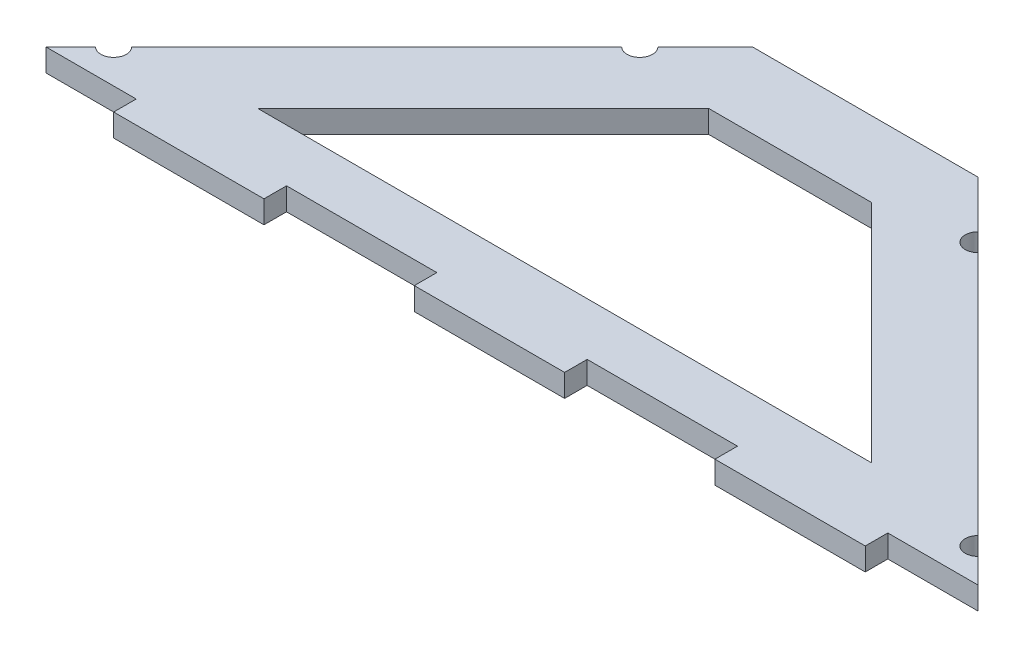
ISO-10303-21;
HEADER;
FILE_DESCRIPTION(('STEP AP214'),'2;1');
FILE_NAME('part.step','',(''),(''),'','','');
FILE_SCHEMA(('AUTOMOTIVE_DESIGN { 1 0 10303 214 1 1 1 1 }'));
ENDSEC;
DATA;
#1=APPLICATION_CONTEXT('core data for automotive mechanical design processes');
#2=APPLICATION_PROTOCOL_DEFINITION('international standard','automotive_design',2000,#1);
#3=PRODUCT_CONTEXT('',#1,'mechanical');
#4=PRODUCT('Part','Part','',(#3));
#5=PRODUCT_RELATED_PRODUCT_CATEGORY('part','',(#4));
#6=PRODUCT_DEFINITION_FORMATION('','',#4);
#7=PRODUCT_DEFINITION_CONTEXT('part definition',#1,'design');
#8=PRODUCT_DEFINITION('design','',#6,#7);
#9=PRODUCT_DEFINITION_SHAPE('','',#8);
#10=(LENGTH_UNIT() NAMED_UNIT(*) SI_UNIT(.MILLI.,.METRE.));
#11=(NAMED_UNIT(*) PLANE_ANGLE_UNIT() SI_UNIT($,.RADIAN.));
#12=(NAMED_UNIT(*) SI_UNIT($,.STERADIAN.) SOLID_ANGLE_UNIT());
#13=UNCERTAINTY_MEASURE_WITH_UNIT(LENGTH_MEASURE(1.E-05),#10,'distance_accuracy_value','');
#14=(GEOMETRIC_REPRESENTATION_CONTEXT(3) GLOBAL_UNCERTAINTY_ASSIGNED_CONTEXT((#13)) GLOBAL_UNIT_ASSIGNED_CONTEXT((#10,
#11,#12)) REPRESENTATION_CONTEXT('',''));
#15=CARTESIAN_POINT('',(0.,0.,0.));
#16=DIRECTION('',(0.,0.,1.));
#17=DIRECTION('',(1.,0.,0.));
#18=AXIS2_PLACEMENT_3D('',#15,#16,#17);
#19=CARTESIAN_POINT('',(0.,3.,65.));
#20=DIRECTION('',(0.,0.,-1.));
#21=DIRECTION('',(-1.,0.,0.));
#22=AXIS2_PLACEMENT_3D('',#19,#20,#21);
#23=PLANE('',#22);
#24=DIRECTION('',(0.,1.,0.));
#25=VECTOR('',#24,1.);
#26=CARTESIAN_POINT('',(-50.,-7.,65.));
#27=LINE('',#26,#25);
#28=CARTESIAN_POINT('',(-50.,0.,65.));
#29=VERTEX_POINT('',#28);
#30=CARTESIAN_POINT('',(-50.,3.,65.));
#31=VERTEX_POINT('',#30);
#32=EDGE_CURVE('E315',#29,#31,#27,.T.);
#33=ORIENTED_EDGE('',*,*,#32,.F.);
#34=DIRECTION('',(1.,0.,0.));
#35=VECTOR('',#34,1.);
#36=CARTESIAN_POINT('',(0.,0.,65.));
#37=LINE('',#36,#35);
#38=CARTESIAN_POINT('',(-30.,0.,65.));
#39=VERTEX_POINT('',#38);
#40=EDGE_CURVE('E502',#29,#39,#37,.T.);
#41=ORIENTED_EDGE('',*,*,#40,.T.);
#42=DIRECTION('',(0.,1.,0.));
#43=VECTOR('',#42,1.);
#44=CARTESIAN_POINT('',(-30.,-7.,65.));
#45=LINE('',#44,#43);
#46=CARTESIAN_POINT('',(-30.,3.,65.));
#47=VERTEX_POINT('',#46);
#48=EDGE_CURVE('E349',#39,#47,#45,.T.);
#49=ORIENTED_EDGE('',*,*,#48,.T.);
#50=DIRECTION('',(1.,0.,0.));
#51=VECTOR('',#50,1.);
#52=CARTESIAN_POINT('',(0.,3.,65.));
#53=LINE('',#52,#51);
#54=EDGE_CURVE('E515',#31,#47,#53,.T.);
#55=ORIENTED_EDGE('',*,*,#54,.F.);
#56=EDGE_LOOP('',(#33,#41,#49,#55));
#57=FACE_BOUND('',#56,.T.);
#58=ADVANCED_FACE('F118',(#57),#23,.F.);
#59=DIRECTION('',(0.,1.,0.));
#60=VECTOR('',#59,1.);
#61=CARTESIAN_POINT('',(-9.99999999999999,-7.,65.));
#62=LINE('',#61,#60);
#63=CARTESIAN_POINT('',(-9.99999999999999,0.,65.));
#64=VERTEX_POINT('',#63);
#65=CARTESIAN_POINT('',(-9.99999999999999,3.,65.));
#66=VERTEX_POINT('',#65);
#67=EDGE_CURVE('E325',#64,#66,#62,.T.);
#68=ORIENTED_EDGE('',*,*,#67,.F.);
#69=CARTESIAN_POINT('',(10.,0.,65.));
#70=VERTEX_POINT('',#69);
#71=EDGE_CURVE('E533',#64,#70,#37,.T.);
#72=ORIENTED_EDGE('',*,*,#71,.T.);
#73=DIRECTION('',(0.,1.,0.));
#74=VECTOR('',#73,1.);
#75=CARTESIAN_POINT('',(10.,-7.,65.));
#76=LINE('',#75,#74);
#77=CARTESIAN_POINT('',(10.,3.,65.));
#78=VERTEX_POINT('',#77);
#79=EDGE_CURVE('E371',#70,#78,#76,.T.);
#80=ORIENTED_EDGE('',*,*,#79,.T.);
#81=EDGE_CURVE('E514',#66,#78,#53,.T.);
#82=ORIENTED_EDGE('',*,*,#81,.F.);
#83=EDGE_LOOP('',(#68,#72,#80,#82));
#84=FACE_BOUND('',#83,.T.);
#85=ADVANCED_FACE('F602',(#84),#23,.F.);
#86=DIRECTION('',(0.,1.,0.));
#87=VECTOR('',#86,1.);
#88=CARTESIAN_POINT('',(30.,-7.,65.));
#89=LINE('',#88,#87);
#90=CARTESIAN_POINT('',(30.,0.,65.));
#91=VERTEX_POINT('',#90);
#92=CARTESIAN_POINT('',(30.,3.,65.));
#93=VERTEX_POINT('',#92);
#94=EDGE_CURVE('E339',#91,#93,#89,.T.);
#95=ORIENTED_EDGE('',*,*,#94,.F.);
#96=CARTESIAN_POINT('',(50.,0.,65.));
#97=VERTEX_POINT('',#96);
#98=EDGE_CURVE('E529',#91,#97,#37,.T.);
#99=ORIENTED_EDGE('',*,*,#98,.T.);
#100=DIRECTION('',(0.,1.,0.));
#101=VECTOR('',#100,1.);
#102=CARTESIAN_POINT('',(50.,-7.,65.));
#103=LINE('',#102,#101);
#104=CARTESIAN_POINT('',(50.,3.,65.));
#105=VERTEX_POINT('',#104);
#106=EDGE_CURVE('E361',#97,#105,#103,.T.);
#107=ORIENTED_EDGE('',*,*,#106,.T.);
#108=EDGE_CURVE('E510',#93,#105,#53,.T.);
#109=ORIENTED_EDGE('',*,*,#108,.F.);
#110=EDGE_LOOP('',(#95,#99,#107,#109));
#111=FACE_BOUND('',#110,.T.);
#112=ADVANCED_FACE('F617',(#111),#23,.F.);
#113=CARTESIAN_POINT('',(0.,0.,0.));
#114=DIRECTION('',(0.,1.,0.));
#115=DIRECTION('',(0.,0.,1.));
#116=AXIS2_PLACEMENT_3D('',#113,#114,#115);
#117=PLANE('',#116);
#118=DIRECTION('',(1.,0.,0.));
#119=VECTOR('',#118,1.);
#120=CARTESIAN_POINT('',(-25.,0.,25.));
#121=LINE('',#120,#119);
#122=CARTESIAN_POINT('',(-10.8578643762691,0.,25.));
#123=VERTEX_POINT('',#122);
#124=CARTESIAN_POINT('',(10.8578643762768,0.,25.));
#125=VERTEX_POINT('',#124);
#126=EDGE_CURVE('E558',#123,#125,#121,.T.);
#127=ORIENTED_EDGE('',*,*,#126,.F.);
#128=DIRECTION('',(0.707106781186547,0.,-0.707106781186548));
#129=VECTOR('',#128,1.);
#130=CARTESIAN_POINT('',(7.07106781186548,0.,7.07106781186548));
#131=LINE('',#130,#129);
#132=CARTESIAN_POINT('',(-40.857864376269,0.,55.));
#133=VERTEX_POINT('',#132);
#134=EDGE_CURVE('E525',#133,#123,#131,.T.);
#135=ORIENTED_EDGE('',*,*,#134,.F.);
#136=DIRECTION('',(1.,0.,0.));
#137=VECTOR('',#136,1.);
#138=CARTESIAN_POINT('',(0.,0.,55.));
#139=LINE('',#138,#137);
#140=CARTESIAN_POINT('',(40.8578643762768,0.,55.));
#141=VERTEX_POINT('',#140);
#142=EDGE_CURVE('E520',#133,#141,#139,.T.);
#143=ORIENTED_EDGE('',*,*,#142,.T.);
#144=DIRECTION('',(-0.707106781186548,0.,-0.707106781186547));
#145=VECTOR('',#144,1.);
#146=CARTESIAN_POINT('',(-7.0710678118616,0.,7.07106781186161));
#147=LINE('',#146,#145);
#148=EDGE_CURVE('E516',#141,#125,#147,.T.);
#149=ORIENTED_EDGE('',*,*,#148,.T.);
#150=EDGE_LOOP('',(#127,#135,#143,#149));
#151=FACE_BOUND('',#150,.T.);
#152=DIRECTION('',(0.,0.,1.));
#153=VECTOR('',#152,1.);
#154=CARTESIAN_POINT('',(-50.,0.,0.));
#155=LINE('',#154,#153);
#156=CARTESIAN_POINT('',(-50.,0.,62.));
#157=VERTEX_POINT('',#156);
#158=EDGE_CURVE('E424',#157,#29,#155,.T.);
#159=ORIENTED_EDGE('',*,*,#158,.F.);
#160=DIRECTION('',(-1.,0.,0.));
#161=VECTOR('',#160,1.);
#162=CARTESIAN_POINT('',(0.,0.,62.));
#163=LINE('',#162,#161);
#164=CARTESIAN_POINT('',(-62.,0.,62.));
#165=VERTEX_POINT('',#164);
#166=EDGE_CURVE('E311',#157,#165,#163,.T.);
#167=ORIENTED_EDGE('',*,*,#166,.T.);
#168=DIRECTION('',(0.707106781186548,0.,-0.707106781186548));
#169=VECTOR('',#168,1.);
#170=CARTESIAN_POINT('',(0.,0.,0.));
#171=LINE('',#170,#169);
#172=CARTESIAN_POINT('',(-58.7020815280171,0.,58.7020815280171));
#173=VERTEX_POINT('',#172);
#174=EDGE_CURVE('E455',#165,#173,#171,.T.);
#175=ORIENTED_EDGE('',*,*,#174,.T.);
#176=CARTESIAN_POINT('',(-57.5,0.,57.5));
#177=DIRECTION('',(0.,1.,0.));
#178=DIRECTION('',(0.,0.,1.));
#179=AXIS2_PLACEMENT_3D('',#176,#177,#178);
#180=CIRCLE('',#179,1.7);
#181=CARTESIAN_POINT('',(-56.2979184719829,0.,56.2979184719829));
#182=VERTEX_POINT('',#181);
#183=EDGE_CURVE('E481',#173,#182,#180,.T.);
#184=ORIENTED_EDGE('',*,*,#183,.T.);
#185=CARTESIAN_POINT('',(-23.7020815280171,0.,23.7020815280171));
#186=VERTEX_POINT('',#185);
#187=EDGE_CURVE('E450',#182,#186,#171,.T.);
#188=ORIENTED_EDGE('',*,*,#187,.T.);
#189=CARTESIAN_POINT('',(-22.5,0.,22.5));
#190=DIRECTION('',(0.,1.,0.));
#191=DIRECTION('',(0.,0.,1.));
#192=AXIS2_PLACEMENT_3D('',#189,#190,#191);
#193=CIRCLE('',#192,1.7);
#194=CARTESIAN_POINT('',(-21.2979184719829,0.,21.2979184719829));
#195=VERTEX_POINT('',#194);
#196=EDGE_CURVE('E473',#186,#195,#193,.T.);
#197=ORIENTED_EDGE('',*,*,#196,.T.);
#198=CARTESIAN_POINT('',(-15.,0.,15.));
#199=VERTEX_POINT('',#198);
#200=EDGE_CURVE('E456',#195,#199,#171,.T.);
#201=ORIENTED_EDGE('',*,*,#200,.T.);
#202=DIRECTION('',(1.,0.,0.));
#203=VECTOR('',#202,1.);
#204=CARTESIAN_POINT('',(-15.,0.,15.));
#205=LINE('',#204,#203);
#206=CARTESIAN_POINT('',(15.,0.,15.));
#207=VERTEX_POINT('',#206);
#208=EDGE_CURVE('E485',#199,#207,#205,.T.);
#209=ORIENTED_EDGE('',*,*,#208,.T.);
#210=DIRECTION('',(0.707106781186548,0.,0.707106781186547));
#211=VECTOR('',#210,1.);
#212=CARTESIAN_POINT('',(0.,0.,0.));
#213=LINE('',#212,#211);
#214=CARTESIAN_POINT('',(21.2979184719829,0.,21.2979184719829));
#215=VERTEX_POINT('',#214);
#216=EDGE_CURVE('E435',#207,#215,#213,.T.);
#217=ORIENTED_EDGE('',*,*,#216,.T.);
#218=CARTESIAN_POINT('',(22.5,0.,22.5));
#219=DIRECTION('',(0.,1.,0.));
#220=DIRECTION('',(0.,0.,1.));
#221=AXIS2_PLACEMENT_3D('',#218,#219,#220);
#222=CIRCLE('',#221,1.7);
#223=CARTESIAN_POINT('',(23.7020815280171,0.,23.7020815280171));
#224=VERTEX_POINT('',#223);
#225=EDGE_CURVE('E464',#215,#224,#222,.T.);
#226=ORIENTED_EDGE('',*,*,#225,.T.);
#227=CARTESIAN_POINT('',(56.2979184719829,0.,56.2979184719829));
#228=VERTEX_POINT('',#227);
#229=EDGE_CURVE('E440',#224,#228,#213,.T.);
#230=ORIENTED_EDGE('',*,*,#229,.T.);
#231=CARTESIAN_POINT('',(57.5,0.,57.5));
#232=DIRECTION('',(0.,1.,0.));
#233=DIRECTION('',(0.,0.,1.));
#234=AXIS2_PLACEMENT_3D('',#231,#232,#233);
#235=CIRCLE('',#234,1.7);
#236=CARTESIAN_POINT('',(58.7020815280172,0.,58.7020815280171));
#237=VERTEX_POINT('',#236);
#238=EDGE_CURVE('E490',#228,#237,#235,.T.);
#239=ORIENTED_EDGE('',*,*,#238,.T.);
#240=CARTESIAN_POINT('',(62.,0.,62.));
#241=VERTEX_POINT('',#240);
#242=EDGE_CURVE('E441',#237,#241,#213,.T.);
#243=ORIENTED_EDGE('',*,*,#242,.T.);
#244=DIRECTION('',(1.,0.,0.));
#245=VECTOR('',#244,1.);
#246=CARTESIAN_POINT('',(0.,0.,62.));
#247=LINE('',#246,#245);
#248=CARTESIAN_POINT('',(50.,0.,62.));
#249=VERTEX_POINT('',#248);
#250=EDGE_CURVE('E395',#249,#241,#247,.T.);
#251=ORIENTED_EDGE('',*,*,#250,.F.);
#252=DIRECTION('',(0.,0.,1.));
#253=VECTOR('',#252,1.);
#254=CARTESIAN_POINT('',(50.,0.,0.));
#255=LINE('',#254,#253);
#256=EDGE_CURVE('E398',#249,#97,#255,.T.);
#257=ORIENTED_EDGE('',*,*,#256,.T.);
#258=ORIENTED_EDGE('',*,*,#98,.F.);
#259=DIRECTION('',(0.,0.,1.));
#260=VECTOR('',#259,1.);
#261=CARTESIAN_POINT('',(30.,0.,0.));
#262=LINE('',#261,#260);
#263=CARTESIAN_POINT('',(30.,0.,62.));
#264=VERTEX_POINT('',#263);
#265=EDGE_CURVE('E410',#264,#91,#262,.T.);
#266=ORIENTED_EDGE('',*,*,#265,.F.);
#267=DIRECTION('',(-1.,0.,0.));
#268=VECTOR('',#267,1.);
#269=CARTESIAN_POINT('',(0.,0.,62.));
#270=LINE('',#269,#268);
#271=CARTESIAN_POINT('',(10.,0.,62.));
#272=VERTEX_POINT('',#271);
#273=EDGE_CURVE('E402',#264,#272,#270,.T.);
#274=ORIENTED_EDGE('',*,*,#273,.T.);
#275=DIRECTION('',(0.,0.,1.));
#276=VECTOR('',#275,1.);
#277=CARTESIAN_POINT('',(10.,0.,0.));
#278=LINE('',#277,#276);
#279=EDGE_CURVE('E406',#272,#70,#278,.T.);
#280=ORIENTED_EDGE('',*,*,#279,.T.);
#281=ORIENTED_EDGE('',*,*,#71,.F.);
#282=DIRECTION('',(0.,0.,1.));
#283=VECTOR('',#282,1.);
#284=CARTESIAN_POINT('',(-9.99999999999999,0.,0.));
#285=LINE('',#284,#283);
#286=CARTESIAN_POINT('',(-9.99999999999999,0.,62.));
#287=VERTEX_POINT('',#286);
#288=EDGE_CURVE('E421',#287,#64,#285,.T.);
#289=ORIENTED_EDGE('',*,*,#288,.F.);
#290=DIRECTION('',(-1.,0.,0.));
#291=VECTOR('',#290,1.);
#292=CARTESIAN_POINT('',(0.,0.,62.));
#293=LINE('',#292,#291);
#294=CARTESIAN_POINT('',(-30.,0.,62.));
#295=VERTEX_POINT('',#294);
#296=EDGE_CURVE('E413',#287,#295,#293,.T.);
#297=ORIENTED_EDGE('',*,*,#296,.T.);
#298=DIRECTION('',(0.,0.,1.));
#299=VECTOR('',#298,1.);
#300=CARTESIAN_POINT('',(-30.,0.,0.));
#301=LINE('',#300,#299);
#302=EDGE_CURVE('E417',#295,#39,#301,.T.);
#303=ORIENTED_EDGE('',*,*,#302,.T.);
#304=ORIENTED_EDGE('',*,*,#40,.F.);
#305=EDGE_LOOP('',(#159,#167,#175,#184,#188,#197,#201,#209,#217,#226,#230,#239,#243,#251,#257,
#258,#266,#274,#280,#281,#289,#297,#303,#304));
#306=FACE_BOUND('',#305,.T.);
#307=ADVANCED_FACE('F588',(#151,#306),#117,.F.);
#308=CARTESIAN_POINT('',(0.,3.,0.));
#309=DIRECTION('',(0.,1.,0.));
#310=DIRECTION('',(0.,0.,1.));
#311=AXIS2_PLACEMENT_3D('',#308,#309,#310);
#312=PLANE('',#311);
#313=DIRECTION('',(0.707106781186547,0.,-0.707106781186548));
#314=VECTOR('',#313,1.);
#315=CARTESIAN_POINT('',(7.07106781186548,3.,7.07106781186548));
#316=LINE('',#315,#314);
#317=CARTESIAN_POINT('',(-40.857864376269,3.,55.));
#318=VERTEX_POINT('',#317);
#319=CARTESIAN_POINT('',(-10.8578643762691,3.,25.));
#320=VERTEX_POINT('',#319);
#321=EDGE_CURVE('E506',#318,#320,#316,.T.);
#322=ORIENTED_EDGE('',*,*,#321,.T.);
#323=DIRECTION('',(1.,0.,0.));
#324=VECTOR('',#323,1.);
#325=CARTESIAN_POINT('',(-25.,3.,25.));
#326=LINE('',#325,#324);
#327=CARTESIAN_POINT('',(10.8578643762768,3.,25.));
#328=VERTEX_POINT('',#327);
#329=EDGE_CURVE('E521',#320,#328,#326,.T.);
#330=ORIENTED_EDGE('',*,*,#329,.T.);
#331=DIRECTION('',(-0.707106781186548,0.,-0.707106781186547));
#332=VECTOR('',#331,1.);
#333=CARTESIAN_POINT('',(-7.0710678118616,3.,7.07106781186161));
#334=LINE('',#333,#332);
#335=CARTESIAN_POINT('',(40.8578643762768,3.,55.));
#336=VERTEX_POINT('',#335);
#337=EDGE_CURVE('E497',#336,#328,#334,.T.);
#338=ORIENTED_EDGE('',*,*,#337,.F.);
#339=DIRECTION('',(1.,0.,0.));
#340=VECTOR('',#339,1.);
#341=CARTESIAN_POINT('',(0.,3.,55.));
#342=LINE('',#341,#340);
#343=EDGE_CURVE('E501',#318,#336,#342,.T.);
#344=ORIENTED_EDGE('',*,*,#343,.F.);
#345=EDGE_LOOP('',(#322,#330,#338,#344));
#346=FACE_BOUND('',#345,.T.);
#347=DIRECTION('',(-1.,0.,0.));
#348=VECTOR('',#347,1.);
#349=CARTESIAN_POINT('',(0.,3.,62.));
#350=LINE('',#349,#348);
#351=CARTESIAN_POINT('',(-50.,3.,62.));
#352=VERTEX_POINT('',#351);
#353=CARTESIAN_POINT('',(-62.,3.,62.));
#354=VERTEX_POINT('',#353);
#355=EDGE_CURVE('E308',#352,#354,#350,.T.);
#356=ORIENTED_EDGE('',*,*,#355,.F.);
#357=DIRECTION('',(0.,0.,1.));
#358=VECTOR('',#357,1.);
#359=CARTESIAN_POINT('',(-50.,3.,0.));
#360=LINE('',#359,#358);
#361=EDGE_CURVE('E318',#352,#31,#360,.T.);
#362=ORIENTED_EDGE('',*,*,#361,.T.);
#363=ORIENTED_EDGE('',*,*,#54,.T.);
#364=DIRECTION('',(0.,0.,1.));
#365=VECTOR('',#364,1.);
#366=CARTESIAN_POINT('',(-30.,3.,0.));
#367=LINE('',#366,#365);
#368=CARTESIAN_POINT('',(-30.,3.,62.));
#369=VERTEX_POINT('',#368);
#370=EDGE_CURVE('E343',#369,#47,#367,.T.);
#371=ORIENTED_EDGE('',*,*,#370,.F.);
#372=DIRECTION('',(-1.,0.,0.));
#373=VECTOR('',#372,1.);
#374=CARTESIAN_POINT('',(0.,3.,62.));
#375=LINE('',#374,#373);
#376=CARTESIAN_POINT('',(-9.99999999999999,3.,62.));
#377=VERTEX_POINT('',#376);
#378=EDGE_CURVE('E338',#377,#369,#375,.T.);
#379=ORIENTED_EDGE('',*,*,#378,.F.);
#380=DIRECTION('',(0.,0.,1.));
#381=VECTOR('',#380,1.);
#382=CARTESIAN_POINT('',(-9.99999999999999,3.,0.));
#383=LINE('',#382,#381);
#384=EDGE_CURVE('E134',#377,#66,#383,.T.);
#385=ORIENTED_EDGE('',*,*,#384,.T.);
#386=ORIENTED_EDGE('',*,*,#81,.T.);
#387=DIRECTION('',(0.,0.,1.));
#388=VECTOR('',#387,1.);
#389=CARTESIAN_POINT('',(10.,3.,0.));
#390=LINE('',#389,#388);
#391=CARTESIAN_POINT('',(10.,3.,62.));
#392=VERTEX_POINT('',#391);
#393=EDGE_CURVE('E365',#392,#78,#390,.T.);
#394=ORIENTED_EDGE('',*,*,#393,.F.);
#395=DIRECTION('',(-1.,0.,0.));
#396=VECTOR('',#395,1.);
#397=CARTESIAN_POINT('',(0.,3.,62.));
#398=LINE('',#397,#396);
#399=CARTESIAN_POINT('',(30.,3.,62.));
#400=VERTEX_POINT('',#399);
#401=EDGE_CURVE('E360',#400,#392,#398,.T.);
#402=ORIENTED_EDGE('',*,*,#401,.F.);
#403=DIRECTION('',(0.,0.,1.));
#404=VECTOR('',#403,1.);
#405=CARTESIAN_POINT('',(30.,3.,0.));
#406=LINE('',#405,#404);
#407=EDGE_CURVE('E142',#400,#93,#406,.T.);
#408=ORIENTED_EDGE('',*,*,#407,.T.);
#409=ORIENTED_EDGE('',*,*,#108,.T.);
#410=DIRECTION('',(0.,0.,1.));
#411=VECTOR('',#410,1.);
#412=CARTESIAN_POINT('',(50.,3.,0.));
#413=LINE('',#412,#411);
#414=CARTESIAN_POINT('',(50.,3.,62.));
#415=VERTEX_POINT('',#414);
#416=EDGE_CURVE('E384',#415,#105,#413,.T.);
#417=ORIENTED_EDGE('',*,*,#416,.F.);
#418=DIRECTION('',(1.,0.,0.));
#419=VECTOR('',#418,1.);
#420=CARTESIAN_POINT('',(0.,3.,62.));
#421=LINE('',#420,#419);
#422=CARTESIAN_POINT('',(62.,3.,62.));
#423=VERTEX_POINT('',#422);
#424=EDGE_CURVE('E380',#415,#423,#421,.T.);
#425=ORIENTED_EDGE('',*,*,#424,.T.);
#426=DIRECTION('',(0.707106781186548,0.,0.707106781186547));
#427=VECTOR('',#426,1.);
#428=CARTESIAN_POINT('',(0.,3.,0.));
#429=LINE('',#428,#427);
#430=CARTESIAN_POINT('',(58.7020815280172,3.,58.7020815280171));
#431=VERTEX_POINT('',#430);
#432=EDGE_CURVE('E427',#431,#423,#429,.T.);
#433=ORIENTED_EDGE('',*,*,#432,.F.);
#434=CARTESIAN_POINT('',(57.5,3.,57.5));
#435=DIRECTION('',(0.,1.,0.));
#436=DIRECTION('',(0.,0.,1.));
#437=AXIS2_PLACEMENT_3D('',#434,#435,#436);
#438=CIRCLE('',#437,1.7);
#439=CARTESIAN_POINT('',(56.2979184719829,3.,56.2979184719829));
#440=VERTEX_POINT('',#439);
#441=EDGE_CURVE('E477',#440,#431,#438,.T.);
#442=ORIENTED_EDGE('',*,*,#441,.F.);
#443=CARTESIAN_POINT('',(23.7020815280171,3.,23.7020815280171));
#444=VERTEX_POINT('',#443);
#445=EDGE_CURVE('E432',#444,#440,#429,.T.);
#446=ORIENTED_EDGE('',*,*,#445,.F.);
#447=CARTESIAN_POINT('',(22.5,3.,22.5));
#448=DIRECTION('',(0.,1.,0.));
#449=DIRECTION('',(0.,0.,1.));
#450=AXIS2_PLACEMENT_3D('',#447,#448,#449);
#451=CIRCLE('',#450,1.7);
#452=CARTESIAN_POINT('',(21.2979184719829,3.,21.2979184719829));
#453=VERTEX_POINT('',#452);
#454=EDGE_CURVE('E469',#453,#444,#451,.T.);
#455=ORIENTED_EDGE('',*,*,#454,.F.);
#456=CARTESIAN_POINT('',(15.,3.,15.));
#457=VERTEX_POINT('',#456);
#458=EDGE_CURVE('E428',#457,#453,#429,.T.);
#459=ORIENTED_EDGE('',*,*,#458,.F.);
#460=DIRECTION('',(1.,0.,0.));
#461=VECTOR('',#460,1.);
#462=CARTESIAN_POINT('',(-15.,3.,15.));
#463=LINE('',#462,#461);
#464=CARTESIAN_POINT('',(-15.,3.,15.));
#465=VERTEX_POINT('',#464);
#466=EDGE_CURVE('E547',#465,#457,#463,.T.);
#467=ORIENTED_EDGE('',*,*,#466,.F.);
#468=DIRECTION('',(0.707106781186548,0.,-0.707106781186548));
#469=VECTOR('',#468,1.);
#470=CARTESIAN_POINT('',(0.,3.,0.));
#471=LINE('',#470,#469);
#472=CARTESIAN_POINT('',(-21.2979184719829,3.,21.2979184719829));
#473=VERTEX_POINT('',#472);
#474=EDGE_CURVE('E431',#473,#465,#471,.T.);
#475=ORIENTED_EDGE('',*,*,#474,.F.);
#476=CARTESIAN_POINT('',(-22.5,3.,22.5));
#477=DIRECTION('',(0.,1.,0.));
#478=DIRECTION('',(0.,0.,1.));
#479=AXIS2_PLACEMENT_3D('',#476,#477,#478);
#480=CIRCLE('',#479,1.7);
#481=CARTESIAN_POINT('',(-23.7020815280171,3.,23.7020815280171));
#482=VERTEX_POINT('',#481);
#483=EDGE_CURVE('E468',#482,#473,#480,.T.);
#484=ORIENTED_EDGE('',*,*,#483,.F.);
#485=CARTESIAN_POINT('',(-56.2979184719829,3.,56.2979184719829));
#486=VERTEX_POINT('',#485);
#487=EDGE_CURVE('E436',#486,#482,#471,.T.);
#488=ORIENTED_EDGE('',*,*,#487,.F.);
#489=CARTESIAN_POINT('',(-57.5,3.,57.5));
#490=DIRECTION('',(0.,1.,0.));
#491=DIRECTION('',(0.,0.,1.));
#492=AXIS2_PLACEMENT_3D('',#489,#490,#491);
#493=CIRCLE('',#492,1.7);
#494=CARTESIAN_POINT('',(-58.7020815280171,3.,58.7020815280171));
#495=VERTEX_POINT('',#494);
#496=EDGE_CURVE('E486',#495,#486,#493,.T.);
#497=ORIENTED_EDGE('',*,*,#496,.F.);
#498=EDGE_CURVE('E330',#354,#495,#471,.T.);
#499=ORIENTED_EDGE('',*,*,#498,.F.);
#500=EDGE_LOOP('',(#356,#362,#363,#371,#379,#385,#386,#394,#402,#408,#409,#417,#425,#433,#442,
#446,#455,#459,#467,#475,#484,#488,#497,#499));
#501=FACE_BOUND('',#500,.T.);
#502=ADVANCED_FACE('F328',(#346,#501),#312,.T.);
#503=CARTESIAN_POINT('',(0.,-7.,0.));
#504=DIRECTION('',(-0.707106781186547,0.,0.707106781186548));
#505=DIRECTION('',(0.707106781186548,0.,0.707106781186547));
#506=AXIS2_PLACEMENT_3D('',#503,#504,#505);
#507=PLANE('',#506);
#508=DIRECTION('',(0.,1.,0.));
#509=VECTOR('',#508,1.);
#510=CARTESIAN_POINT('',(62.,-7.,62.));
#511=LINE('',#510,#509);
#512=EDGE_CURVE('E12',#241,#423,#511,.T.);
#513=ORIENTED_EDGE('',*,*,#512,.F.);
#514=ORIENTED_EDGE('',*,*,#242,.F.);
#515=DIRECTION('',(0.,1.,0.));
#516=VECTOR('',#515,1.);
#517=CARTESIAN_POINT('',(58.7020815280172,0.,58.7020815280171));
#518=LINE('',#517,#516);
#519=EDGE_CURVE('E446',#431,#237,#518,.F.);
#520=ORIENTED_EDGE('',*,*,#519,.F.);
#521=ORIENTED_EDGE('',*,*,#432,.T.);
#522=EDGE_LOOP('',(#513,#514,#520,#521));
#523=FACE_BOUND('',#522,.T.);
#524=ADVANCED_FACE('F632',(#523),#507,.F.);
#525=CARTESIAN_POINT('',(-7.0710678118616,3.,7.07106781186161));
#526=DIRECTION('',(-0.707106781186547,0.,0.707106781186548));
#527=DIRECTION('',(0.707106781186548,0.,0.707106781186547));
#528=AXIS2_PLACEMENT_3D('',#525,#526,#527);
#529=PLANE('',#528);
#530=ORIENTED_EDGE('',*,*,#148,.F.);
#531=DIRECTION('',(0.,-1.,0.));
#532=VECTOR('',#531,1.);
#533=CARTESIAN_POINT('',(40.8578643762768,3.,55.));
#534=LINE('',#533,#532);
#535=EDGE_CURVE('E540',#336,#141,#534,.T.);
#536=ORIENTED_EDGE('',*,*,#535,.F.);
#537=ORIENTED_EDGE('',*,*,#337,.T.);
#538=DIRECTION('',(0.,-1.,0.));
#539=VECTOR('',#538,1.);
#540=CARTESIAN_POINT('',(10.8578643762768,3.,25.));
#541=LINE('',#540,#539);
#542=EDGE_CURVE('E543',#328,#125,#541,.T.);
#543=ORIENTED_EDGE('',*,*,#542,.T.);
#544=EDGE_LOOP('',(#530,#536,#537,#543));
#545=FACE_BOUND('',#544,.T.);
#546=ADVANCED_FACE('F704',(#545),#529,.T.);
#547=CARTESIAN_POINT('',(0.,3.,55.));
#548=DIRECTION('',(0.,0.,-1.));
#549=DIRECTION('',(-1.,0.,0.));
#550=AXIS2_PLACEMENT_3D('',#547,#548,#549);
#551=PLANE('',#550);
#552=ORIENTED_EDGE('',*,*,#142,.F.);
#553=DIRECTION('',(0.,-1.,0.));
#554=VECTOR('',#553,1.);
#555=CARTESIAN_POINT('',(-40.857864376269,3.,55.));
#556=LINE('',#555,#554);
#557=EDGE_CURVE('E537',#318,#133,#556,.T.);
#558=ORIENTED_EDGE('',*,*,#557,.F.);
#559=ORIENTED_EDGE('',*,*,#343,.T.);
#560=ORIENTED_EDGE('',*,*,#535,.T.);
#561=EDGE_LOOP('',(#552,#558,#559,#560));
#562=FACE_BOUND('',#561,.T.);
#563=ADVANCED_FACE('F706',(#562),#551,.T.);
#564=CARTESIAN_POINT('',(7.07106781186548,3.,7.07106781186548));
#565=DIRECTION('',(-0.707106781186548,0.,-0.707106781186547));
#566=DIRECTION('',(-0.707106781186547,0.,0.707106781186548));
#567=AXIS2_PLACEMENT_3D('',#564,#565,#566);
#568=PLANE('',#567);
#569=ORIENTED_EDGE('',*,*,#134,.T.);
#570=DIRECTION('',(0.,-1.,0.));
#571=VECTOR('',#570,1.);
#572=CARTESIAN_POINT('',(-10.8578643762691,3.,25.));
#573=LINE('',#572,#571);
#574=EDGE_CURVE('E534',#320,#123,#573,.T.);
#575=ORIENTED_EDGE('',*,*,#574,.F.);
#576=ORIENTED_EDGE('',*,*,#321,.F.);
#577=ORIENTED_EDGE('',*,*,#557,.T.);
#578=EDGE_LOOP('',(#569,#575,#576,#577));
#579=FACE_BOUND('',#578,.T.);
#580=ADVANCED_FACE('F700',(#579),#568,.F.);
#581=CARTESIAN_POINT('',(-25.,3.,25.));
#582=DIRECTION('',(0.,0.,-1.));
#583=DIRECTION('',(-1.,0.,0.));
#584=AXIS2_PLACEMENT_3D('',#581,#582,#583);
#585=PLANE('',#584);
#586=ORIENTED_EDGE('',*,*,#542,.F.);
#587=ORIENTED_EDGE('',*,*,#329,.F.);
#588=ORIENTED_EDGE('',*,*,#574,.T.);
#589=ORIENTED_EDGE('',*,*,#126,.T.);
#590=EDGE_LOOP('',(#586,#587,#588,#589));
#591=FACE_BOUND('',#590,.T.);
#592=ADVANCED_FACE('F120',(#591),#585,.F.);
#593=CARTESIAN_POINT('',(-15.,3.,15.));
#594=DIRECTION('',(0.,0.,-1.));
#595=DIRECTION('',(-1.,0.,0.));
#596=AXIS2_PLACEMENT_3D('',#593,#594,#595);
#597=PLANE('',#596);
#598=ORIENTED_EDGE('',*,*,#208,.F.);
#599=DIRECTION('',(0.,-1.,0.));
#600=VECTOR('',#599,1.);
#601=CARTESIAN_POINT('',(-15.,3.,15.));
#602=LINE('',#601,#600);
#603=EDGE_CURVE('E555',#465,#199,#602,.T.);
#604=ORIENTED_EDGE('',*,*,#603,.F.);
#605=ORIENTED_EDGE('',*,*,#466,.T.);
#606=DIRECTION('',(0.,-1.,0.));
#607=VECTOR('',#606,1.);
#608=CARTESIAN_POINT('',(15.,3.,15.));
#609=LINE('',#608,#607);
#610=EDGE_CURVE('E551',#457,#207,#609,.T.);
#611=ORIENTED_EDGE('',*,*,#610,.T.);
#612=EDGE_LOOP('',(#598,#604,#605,#611));
#613=FACE_BOUND('',#612,.T.);
#614=ADVANCED_FACE('F656',(#613),#597,.T.);
#615=CARTESIAN_POINT('',(-57.5,0.,57.5));
#616=DIRECTION('',(0.,1.,0.));
#617=DIRECTION('',(0.,0.,1.));
#618=AXIS2_PLACEMENT_3D('',#615,#616,#617);
#619=CYLINDRICAL_SURFACE('',#618,1.7);
#620=ORIENTED_EDGE('',*,*,#496,.T.);
#621=DIRECTION('',(0.,1.,0.));
#622=VECTOR('',#621,1.);
#623=CARTESIAN_POINT('',(-56.2979184719829,0.,56.2979184719829));
#624=LINE('',#623,#622);
#625=EDGE_CURVE('E454',#486,#182,#624,.F.);
#626=ORIENTED_EDGE('',*,*,#625,.T.);
#627=ORIENTED_EDGE('',*,*,#183,.F.);
#628=DIRECTION('',(0.,1.,0.));
#629=VECTOR('',#628,1.);
#630=CARTESIAN_POINT('',(-58.7020815280171,0.,58.7020815280171));
#631=LINE('',#630,#629);
#632=EDGE_CURVE('E460',#173,#495,#631,.T.);
#633=ORIENTED_EDGE('',*,*,#632,.T.);
#634=EDGE_LOOP('',(#620,#626,#627,#633));
#635=FACE_BOUND('',#634,.T.);
#636=ADVANCED_FACE('F697',(#635),#619,.F.);
#637=CARTESIAN_POINT('',(57.5,0.,57.5));
#638=DIRECTION('',(0.,1.,0.));
#639=DIRECTION('',(0.,0.,1.));
#640=AXIS2_PLACEMENT_3D('',#637,#638,#639);
#641=CYLINDRICAL_SURFACE('',#640,1.7);
#642=ORIENTED_EDGE('',*,*,#441,.T.);
#643=ORIENTED_EDGE('',*,*,#519,.T.);
#644=ORIENTED_EDGE('',*,*,#238,.F.);
#645=DIRECTION('',(0.,1.,0.));
#646=VECTOR('',#645,1.);
#647=CARTESIAN_POINT('',(56.2979184719829,0.,56.2979184719829));
#648=LINE('',#647,#646);
#649=EDGE_CURVE('E442',#228,#440,#648,.T.);
#650=ORIENTED_EDGE('',*,*,#649,.T.);
#651=EDGE_LOOP('',(#642,#643,#644,#650));
#652=FACE_BOUND('',#651,.T.);
#653=ADVANCED_FACE('F642',(#652),#641,.F.);
#654=CARTESIAN_POINT('',(-22.5,0.,22.5));
#655=DIRECTION('',(0.,1.,0.));
#656=DIRECTION('',(0.,0.,1.));
#657=AXIS2_PLACEMENT_3D('',#654,#655,#656);
#658=CYLINDRICAL_SURFACE('',#657,1.7);
#659=ORIENTED_EDGE('',*,*,#483,.T.);
#660=DIRECTION('',(0.,1.,0.));
#661=VECTOR('',#660,1.);
#662=CARTESIAN_POINT('',(-21.2979184719829,0.,21.2979184719829));
#663=LINE('',#662,#661);
#664=EDGE_CURVE('E579',#473,#195,#663,.F.);
#665=ORIENTED_EDGE('',*,*,#664,.T.);
#666=ORIENTED_EDGE('',*,*,#196,.F.);
#667=DIRECTION('',(0.,1.,0.));
#668=VECTOR('',#667,1.);
#669=CARTESIAN_POINT('',(-23.7020815280171,0.,23.7020815280171));
#670=LINE('',#669,#668);
#671=EDGE_CURVE('E575',#186,#482,#670,.T.);
#672=ORIENTED_EDGE('',*,*,#671,.T.);
#673=EDGE_LOOP('',(#659,#665,#666,#672));
#674=FACE_BOUND('',#673,.T.);
#675=ADVANCED_FACE('F665',(#674),#658,.F.);
#676=CARTESIAN_POINT('',(22.5,0.,22.5));
#677=DIRECTION('',(0.,1.,0.));
#678=DIRECTION('',(0.,0.,1.));
#679=AXIS2_PLACEMENT_3D('',#676,#677,#678);
#680=CYLINDRICAL_SURFACE('',#679,1.7);
#681=ORIENTED_EDGE('',*,*,#454,.T.);
#682=DIRECTION('',(0.,1.,0.));
#683=VECTOR('',#682,1.);
#684=CARTESIAN_POINT('',(23.7020815280171,0.,23.7020815280171));
#685=LINE('',#684,#683);
#686=EDGE_CURVE('E571',#444,#224,#685,.F.);
#687=ORIENTED_EDGE('',*,*,#686,.T.);
#688=ORIENTED_EDGE('',*,*,#225,.F.);
#689=DIRECTION('',(0.,1.,0.));
#690=VECTOR('',#689,1.);
#691=CARTESIAN_POINT('',(21.2979184719829,0.,21.2979184719829));
#692=LINE('',#691,#690);
#693=EDGE_CURVE('E546',#215,#453,#692,.T.);
#694=ORIENTED_EDGE('',*,*,#693,.T.);
#695=EDGE_LOOP('',(#681,#687,#688,#694));
#696=FACE_BOUND('',#695,.T.);
#697=ADVANCED_FACE('F663',(#696),#680,.F.);
#698=ORIENTED_EDGE('',*,*,#610,.F.);
#699=ORIENTED_EDGE('',*,*,#458,.T.);
#700=ORIENTED_EDGE('',*,*,#693,.F.);
#701=ORIENTED_EDGE('',*,*,#216,.F.);
#702=EDGE_LOOP('',(#698,#699,#700,#701));
#703=FACE_BOUND('',#702,.T.);
#704=ADVANCED_FACE('F660',(#703),#507,.F.);
#705=ORIENTED_EDGE('',*,*,#229,.F.);
#706=ORIENTED_EDGE('',*,*,#686,.F.);
#707=ORIENTED_EDGE('',*,*,#445,.T.);
#708=ORIENTED_EDGE('',*,*,#649,.F.);
#709=EDGE_LOOP('',(#705,#706,#707,#708));
#710=FACE_BOUND('',#709,.T.);
#711=ADVANCED_FACE('F637',(#710),#507,.F.);
#712=CARTESIAN_POINT('',(0.,-7.,0.));
#713=DIRECTION('',(0.707106781186548,0.,0.707106781186548));
#714=DIRECTION('',(0.707106781186548,0.,-0.707106781186548));
#715=AXIS2_PLACEMENT_3D('',#712,#713,#714);
#716=PLANE('',#715);
#717=ORIENTED_EDGE('',*,*,#487,.T.);
#718=ORIENTED_EDGE('',*,*,#671,.F.);
#719=ORIENTED_EDGE('',*,*,#187,.F.);
#720=ORIENTED_EDGE('',*,*,#625,.F.);
#721=EDGE_LOOP('',(#717,#718,#719,#720));
#722=FACE_BOUND('',#721,.T.);
#723=ADVANCED_FACE('F733',(#722),#716,.F.);
#724=ORIENTED_EDGE('',*,*,#664,.F.);
#725=ORIENTED_EDGE('',*,*,#474,.T.);
#726=ORIENTED_EDGE('',*,*,#603,.T.);
#727=ORIENTED_EDGE('',*,*,#200,.F.);
#728=EDGE_LOOP('',(#724,#725,#726,#727));
#729=FACE_BOUND('',#728,.T.);
#730=ADVANCED_FACE('F737',(#729),#716,.F.);
#731=ORIENTED_EDGE('',*,*,#174,.F.);
#732=DIRECTION('',(0.,1.,0.));
#733=VECTOR('',#732,1.);
#734=CARTESIAN_POINT('',(-62.,-7.,62.));
#735=LINE('',#734,#733);
#736=EDGE_CURVE('E127',#165,#354,#735,.T.);
#737=ORIENTED_EDGE('',*,*,#736,.T.);
#738=ORIENTED_EDGE('',*,*,#498,.T.);
#739=ORIENTED_EDGE('',*,*,#632,.F.);
#740=EDGE_LOOP('',(#731,#737,#738,#739));
#741=FACE_BOUND('',#740,.T.);
#742=ADVANCED_FACE('F585',(#741),#716,.F.);
#743=CARTESIAN_POINT('',(-50.,-7.,0.));
#744=DIRECTION('',(-1.,0.,0.));
#745=DIRECTION('',(0.,0.,1.));
#746=AXIS2_PLACEMENT_3D('',#743,#744,#745);
#747=PLANE('',#746);
#748=ORIENTED_EDGE('',*,*,#158,.T.);
#749=ORIENTED_EDGE('',*,*,#32,.T.);
#750=ORIENTED_EDGE('',*,*,#361,.F.);
#751=DIRECTION('',(0.,1.,0.));
#752=VECTOR('',#751,1.);
#753=CARTESIAN_POINT('',(-50.,-7.,62.));
#754=LINE('',#753,#752);
#755=EDGE_CURVE('E304',#157,#352,#754,.T.);
#756=ORIENTED_EDGE('',*,*,#755,.F.);
#757=EDGE_LOOP('',(#748,#749,#750,#756));
#758=FACE_BOUND('',#757,.T.);
#759=ADVANCED_FACE('F319',(#758),#747,.T.);
#760=CARTESIAN_POINT('',(0.,-7.,62.));
#761=DIRECTION('',(0.,0.,-1.));
#762=DIRECTION('',(-1.,0.,0.));
#763=AXIS2_PLACEMENT_3D('',#760,#761,#762);
#764=PLANE('',#763);
#765=ORIENTED_EDGE('',*,*,#755,.T.);
#766=ORIENTED_EDGE('',*,*,#355,.T.);
#767=ORIENTED_EDGE('',*,*,#736,.F.);
#768=ORIENTED_EDGE('',*,*,#166,.F.);
#769=EDGE_LOOP('',(#765,#766,#767,#768));
#770=FACE_BOUND('',#769,.T.);
#771=ADVANCED_FACE('F306',(#770),#764,.F.);
#772=CARTESIAN_POINT('',(50.,-7.,0.));
#773=DIRECTION('',(-1.,0.,0.));
#774=DIRECTION('',(0.,0.,1.));
#775=AXIS2_PLACEMENT_3D('',#772,#773,#774);
#776=PLANE('',#775);
#777=DIRECTION('',(0.,1.,0.));
#778=VECTOR('',#777,1.);
#779=CARTESIAN_POINT('',(50.,-7.,62.));
#780=LINE('',#779,#778);
#781=EDGE_CURVE('E387',#249,#415,#780,.T.);
#782=ORIENTED_EDGE('',*,*,#781,.T.);
#783=ORIENTED_EDGE('',*,*,#416,.T.);
#784=ORIENTED_EDGE('',*,*,#106,.F.);
#785=ORIENTED_EDGE('',*,*,#256,.F.);
#786=EDGE_LOOP('',(#782,#783,#784,#785));
#787=FACE_BOUND('',#786,.T.);
#788=ADVANCED_FACE('F622',(#787),#776,.F.);
#789=CARTESIAN_POINT('',(0.,-7.,62.));
#790=DIRECTION('',(0.,0.,1.));
#791=DIRECTION('',(1.,0.,0.));
#792=AXIS2_PLACEMENT_3D('',#789,#790,#791);
#793=PLANE('',#792);
#794=ORIENTED_EDGE('',*,*,#250,.T.);
#795=ORIENTED_EDGE('',*,*,#512,.T.);
#796=ORIENTED_EDGE('',*,*,#424,.F.);
#797=ORIENTED_EDGE('',*,*,#781,.F.);
#798=EDGE_LOOP('',(#794,#795,#796,#797));
#799=FACE_BOUND('',#798,.T.);
#800=ADVANCED_FACE('F625',(#799),#793,.T.);
#801=CARTESIAN_POINT('',(30.,-7.,0.));
#802=DIRECTION('',(-1.,0.,0.));
#803=DIRECTION('',(0.,0.,1.));
#804=AXIS2_PLACEMENT_3D('',#801,#802,#803);
#805=PLANE('',#804);
#806=ORIENTED_EDGE('',*,*,#265,.T.);
#807=ORIENTED_EDGE('',*,*,#94,.T.);
#808=ORIENTED_EDGE('',*,*,#407,.F.);
#809=DIRECTION('',(0.,1.,0.));
#810=VECTOR('',#809,1.);
#811=CARTESIAN_POINT('',(30.,-7.,62.));
#812=LINE('',#811,#810);
#813=EDGE_CURVE('E368',#264,#400,#812,.T.);
#814=ORIENTED_EDGE('',*,*,#813,.F.);
#815=EDGE_LOOP('',(#806,#807,#808,#814));
#816=FACE_BOUND('',#815,.T.);
#817=ADVANCED_FACE('F613',(#816),#805,.T.);
#818=CARTESIAN_POINT('',(10.,-7.,0.));
#819=DIRECTION('',(-1.,0.,0.));
#820=DIRECTION('',(0.,0.,1.));
#821=AXIS2_PLACEMENT_3D('',#818,#819,#820);
#822=PLANE('',#821);
#823=DIRECTION('',(0.,1.,0.));
#824=VECTOR('',#823,1.);
#825=CARTESIAN_POINT('',(10.,-7.,62.));
#826=LINE('',#825,#824);
#827=EDGE_CURVE('E375',#272,#392,#826,.T.);
#828=ORIENTED_EDGE('',*,*,#827,.T.);
#829=ORIENTED_EDGE('',*,*,#393,.T.);
#830=ORIENTED_EDGE('',*,*,#79,.F.);
#831=ORIENTED_EDGE('',*,*,#279,.F.);
#832=EDGE_LOOP('',(#828,#829,#830,#831));
#833=FACE_BOUND('',#832,.T.);
#834=ADVANCED_FACE('F606',(#833),#822,.F.);
#835=CARTESIAN_POINT('',(0.,-7.,62.));
#836=DIRECTION('',(0.,0.,-1.));
#837=DIRECTION('',(-1.,0.,0.));
#838=AXIS2_PLACEMENT_3D('',#835,#836,#837);
#839=PLANE('',#838);
#840=ORIENTED_EDGE('',*,*,#813,.T.);
#841=ORIENTED_EDGE('',*,*,#401,.T.);
#842=ORIENTED_EDGE('',*,*,#827,.F.);
#843=ORIENTED_EDGE('',*,*,#273,.F.);
#844=EDGE_LOOP('',(#840,#841,#842,#843));
#845=FACE_BOUND('',#844,.T.);
#846=ADVANCED_FACE('F612',(#845),#839,.F.);
#847=CARTESIAN_POINT('',(-9.99999999999999,-7.,0.));
#848=DIRECTION('',(-1.,0.,0.));
#849=DIRECTION('',(0.,0.,1.));
#850=AXIS2_PLACEMENT_3D('',#847,#848,#849);
#851=PLANE('',#850);
#852=ORIENTED_EDGE('',*,*,#288,.T.);
#853=ORIENTED_EDGE('',*,*,#67,.T.);
#854=ORIENTED_EDGE('',*,*,#384,.F.);
#855=DIRECTION('',(0.,1.,0.));
#856=VECTOR('',#855,1.);
#857=CARTESIAN_POINT('',(-9.99999999999999,-7.,62.));
#858=LINE('',#857,#856);
#859=EDGE_CURVE('E346',#287,#377,#858,.T.);
#860=ORIENTED_EDGE('',*,*,#859,.F.);
#861=EDGE_LOOP('',(#852,#853,#854,#860));
#862=FACE_BOUND('',#861,.T.);
#863=ADVANCED_FACE('F757',(#862),#851,.T.);
#864=CARTESIAN_POINT('',(-30.,-7.,0.));
#865=DIRECTION('',(-1.,0.,0.));
#866=DIRECTION('',(0.,0.,1.));
#867=AXIS2_PLACEMENT_3D('',#864,#865,#866);
#868=PLANE('',#867);
#869=DIRECTION('',(0.,1.,0.));
#870=VECTOR('',#869,1.);
#871=CARTESIAN_POINT('',(-30.,-7.,62.));
#872=LINE('',#871,#870);
#873=EDGE_CURVE('E353',#295,#369,#872,.T.);
#874=ORIENTED_EDGE('',*,*,#873,.T.);
#875=ORIENTED_EDGE('',*,*,#370,.T.);
#876=ORIENTED_EDGE('',*,*,#48,.F.);
#877=ORIENTED_EDGE('',*,*,#302,.F.);
#878=EDGE_LOOP('',(#874,#875,#876,#877));
#879=FACE_BOUND('',#878,.T.);
#880=ADVANCED_FACE('F753',(#879),#868,.F.);
#881=CARTESIAN_POINT('',(0.,-7.,62.));
#882=DIRECTION('',(0.,0.,-1.));
#883=DIRECTION('',(-1.,0.,0.));
#884=AXIS2_PLACEMENT_3D('',#881,#882,#883);
#885=PLANE('',#884);
#886=ORIENTED_EDGE('',*,*,#859,.T.);
#887=ORIENTED_EDGE('',*,*,#378,.T.);
#888=ORIENTED_EDGE('',*,*,#873,.F.);
#889=ORIENTED_EDGE('',*,*,#296,.F.);
#890=EDGE_LOOP('',(#886,#887,#888,#889));
#891=FACE_BOUND('',#890,.T.);
#892=ADVANCED_FACE('F756',(#891),#885,.F.);
#893=CLOSED_SHELL('',(#58,#85,#112,#307,#502,#524,#546,#563,#580,#592,#614,#636,#653,#675,#697,
#704,#711,#723,#730,#742,#759,#771,#788,#800,#817,#834,#846,#863,#880,#892));
#894=MANIFOLD_SOLID_BREP('B2',#893);
#895=ADVANCED_BREP_SHAPE_REPRESENTATION('',(#18,#894),#14);
#896=SHAPE_DEFINITION_REPRESENTATION(#9,#895);
ENDSEC;
END-ISO-10303-21;
